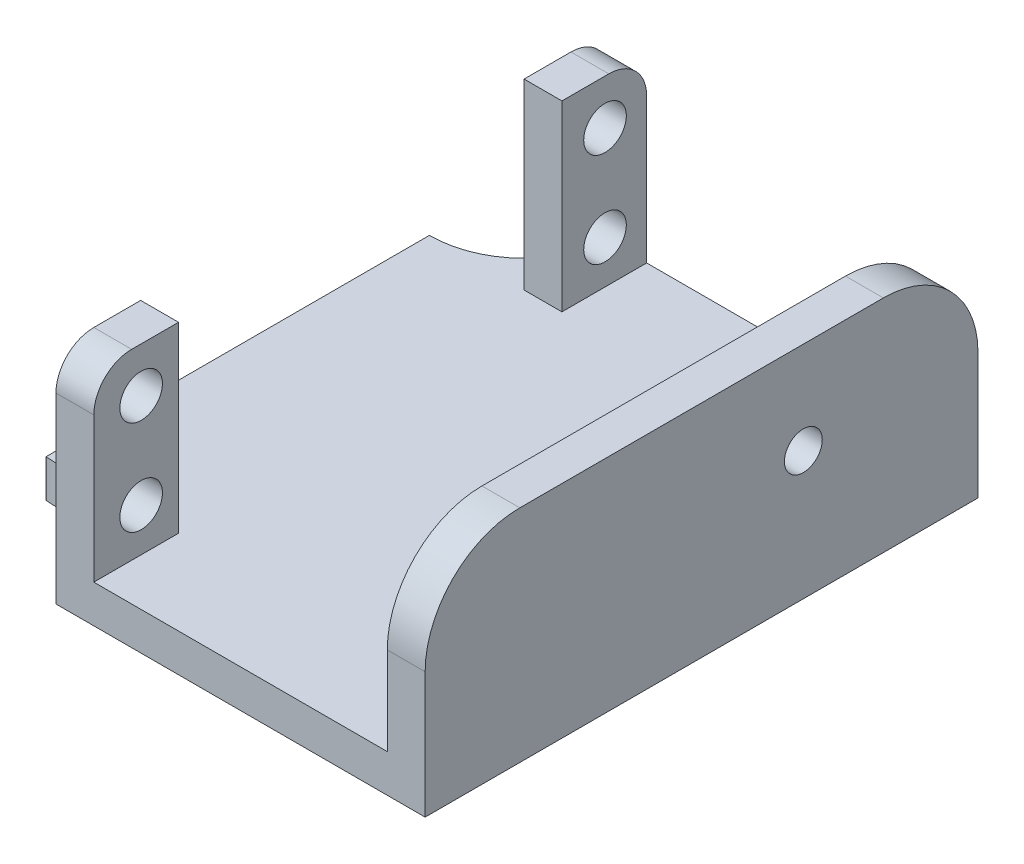
ISO-10303-21;
HEADER;
FILE_DESCRIPTION(('STEP AP214'),'2;1');
FILE_NAME('part.step','',(''),(''),'','','');
FILE_SCHEMA(('AUTOMOTIVE_DESIGN { 1 0 10303 214 1 1 1 1 }'));
ENDSEC;
DATA;
#1=APPLICATION_CONTEXT('core data for automotive mechanical design processes');
#2=APPLICATION_PROTOCOL_DEFINITION('international standard','automotive_design',2000,#1);
#3=PRODUCT_CONTEXT('',#1,'mechanical');
#4=PRODUCT('Part','Part','',(#3));
#5=PRODUCT_RELATED_PRODUCT_CATEGORY('part','',(#4));
#6=PRODUCT_DEFINITION_FORMATION('','',#4);
#7=PRODUCT_DEFINITION_CONTEXT('part definition',#1,'design');
#8=PRODUCT_DEFINITION('design','',#6,#7);
#9=PRODUCT_DEFINITION_SHAPE('','',#8);
#10=(LENGTH_UNIT() NAMED_UNIT(*) SI_UNIT(.MILLI.,.METRE.));
#11=(NAMED_UNIT(*) PLANE_ANGLE_UNIT() SI_UNIT($,.RADIAN.));
#12=(NAMED_UNIT(*) SI_UNIT($,.STERADIAN.) SOLID_ANGLE_UNIT());
#13=UNCERTAINTY_MEASURE_WITH_UNIT(LENGTH_MEASURE(1.E-05),#10,'distance_accuracy_value','');
#14=(GEOMETRIC_REPRESENTATION_CONTEXT(3) GLOBAL_UNCERTAINTY_ASSIGNED_CONTEXT((#13)) GLOBAL_UNIT_ASSIGNED_CONTEXT((#10,
#11,#12)) REPRESENTATION_CONTEXT('',''));
#15=CARTESIAN_POINT('',(0.,0.,0.));
#16=DIRECTION('',(0.,0.,1.));
#17=DIRECTION('',(1.,0.,0.));
#18=AXIS2_PLACEMENT_3D('',#15,#16,#17);
#19=CARTESIAN_POINT('',(0.,4.,0.));
#20=DIRECTION('',(0.,-1.,0.));
#21=DIRECTION('',(0.,0.,-1.));
#22=AXIS2_PLACEMENT_3D('',#19,#20,#21);
#23=PLANE('',#22);
#24=DIRECTION('',(0.,0.,-1.));
#25=VECTOR('',#24,1.);
#26=CARTESIAN_POINT('',(-4.,4.,0.));
#27=LINE('',#26,#25);
#28=CARTESIAN_POINT('',(-4.,4.,0.));
#29=VERTEX_POINT('',#28);
#30=CARTESIAN_POINT('',(-4.,4.,-58.4));
#31=VERTEX_POINT('',#30);
#32=EDGE_CURVE('E193',#29,#31,#27,.T.);
#33=ORIENTED_EDGE('',*,*,#32,.T.);
#34=DIRECTION('',(-1.,0.,0.));
#35=VECTOR('',#34,1.);
#36=CARTESIAN_POINT('',(-39.,4.,-58.4));
#37=LINE('',#36,#35);
#38=CARTESIAN_POINT('',(-35.,4.,-58.4));
#39=VERTEX_POINT('',#38);
#40=EDGE_CURVE('E179',#31,#39,#37,.T.);
#41=ORIENTED_EDGE('',*,*,#40,.T.);
#42=DIRECTION('',(0.,0.,1.));
#43=VECTOR('',#42,1.);
#44=CARTESIAN_POINT('',(-35.,4.,-58.4));
#45=LINE('',#44,#43);
#46=CARTESIAN_POINT('',(-35.,4.,-49.45));
#47=VERTEX_POINT('',#46);
#48=EDGE_CURVE('E223',#39,#47,#45,.T.);
#49=ORIENTED_EDGE('',*,*,#48,.T.);
#50=DIRECTION('',(-1.,0.,0.));
#51=VECTOR('',#50,1.);
#52=CARTESIAN_POINT('',(-35.,4.,-49.45));
#53=LINE('',#52,#51);
#54=CARTESIAN_POINT('',(-39.,4.,-49.45));
#55=VERTEX_POINT('',#54);
#56=EDGE_CURVE('E232',#47,#55,#53,.T.);
#57=ORIENTED_EDGE('',*,*,#56,.T.);
#58=DIRECTION('',(0.,0.,1.));
#59=VECTOR('',#58,1.);
#60=CARTESIAN_POINT('',(-39.,4.,0.));
#61=LINE('',#60,#59);
#62=CARTESIAN_POINT('',(-39.,4.,-58.4));
#63=VERTEX_POINT('',#62);
#64=EDGE_CURVE('E323',#63,#55,#61,.T.);
#65=ORIENTED_EDGE('',*,*,#64,.F.);
#66=CARTESIAN_POINT('',(-48.9447222183428,4.,-59.45));
#67=DIRECTION('',(0.,-1.,0.));
#68=DIRECTION('',(0.,0.,-1.));
#69=AXIS2_PLACEMENT_3D('',#66,#67,#68);
#70=CIRCLE('',#69,10.);
#71=CARTESIAN_POINT('',(-48.9447222183428,4.,-49.45));
#72=VERTEX_POINT('',#71);
#73=EDGE_CURVE('E332',#63,#72,#70,.T.);
#74=ORIENTED_EDGE('',*,*,#73,.T.);
#75=DIRECTION('',(-1.,0.,0.));
#76=VECTOR('',#75,1.);
#77=CARTESIAN_POINT('',(-49.,4.,-49.45));
#78=LINE('',#77,#76);
#79=CARTESIAN_POINT('',(-49.,4.,-49.45));
#80=VERTEX_POINT('',#79);
#81=EDGE_CURVE('E188',#72,#80,#78,.T.);
#82=ORIENTED_EDGE('',*,*,#81,.T.);
#83=DIRECTION('',(0.,0.,1.));
#84=VECTOR('',#83,1.);
#85=CARTESIAN_POINT('',(-49.,4.,-8.94999999999999));
#86=LINE('',#85,#84);
#87=CARTESIAN_POINT('',(-49.,4.,-8.94999999999999));
#88=VERTEX_POINT('',#87);
#89=EDGE_CURVE('E275',#80,#88,#86,.T.);
#90=ORIENTED_EDGE('',*,*,#89,.T.);
#91=DIRECTION('',(1.,0.,0.));
#92=VECTOR('',#91,1.);
#93=CARTESIAN_POINT('',(-39.,4.,-8.95));
#94=LINE('',#93,#92);
#95=CARTESIAN_POINT('',(-48.9447222183428,4.,-8.94999999999999));
#96=VERTEX_POINT('',#95);
#97=EDGE_CURVE('E278',#88,#96,#94,.T.);
#98=ORIENTED_EDGE('',*,*,#97,.T.);
#99=CARTESIAN_POINT('',(-48.9447222183428,4.,1.05000000000001));
#100=DIRECTION('',(0.,-1.,0.));
#101=DIRECTION('',(0.,0.,-1.));
#102=AXIS2_PLACEMENT_3D('',#99,#100,#101);
#103=CIRCLE('',#102,10.);
#104=CARTESIAN_POINT('',(-39.,4.,0.));
#105=VERTEX_POINT('',#104);
#106=EDGE_CURVE('E327',#96,#105,#103,.T.);
#107=ORIENTED_EDGE('',*,*,#106,.T.);
#108=DIRECTION('',(0.,0.,1.));
#109=VECTOR('',#108,1.);
#110=CARTESIAN_POINT('',(-39.,4.,0.));
#111=LINE('',#110,#109);
#112=CARTESIAN_POINT('',(-39.,4.,-8.95));
#113=VERTEX_POINT('',#112);
#114=EDGE_CURVE('E315',#113,#105,#111,.T.);
#115=ORIENTED_EDGE('',*,*,#114,.F.);
#116=DIRECTION('',(-1.,0.,0.));
#117=VECTOR('',#116,1.);
#118=CARTESIAN_POINT('',(-35.,4.,-8.95));
#119=LINE('',#118,#117);
#120=CARTESIAN_POINT('',(-35.,4.,-8.95));
#121=VERTEX_POINT('',#120);
#122=EDGE_CURVE('E265',#121,#113,#119,.T.);
#123=ORIENTED_EDGE('',*,*,#122,.F.);
#124=DIRECTION('',(0.,0.,1.));
#125=VECTOR('',#124,1.);
#126=CARTESIAN_POINT('',(-35.,4.,-8.95));
#127=LINE('',#126,#125);
#128=CARTESIAN_POINT('',(-35.,4.,0.));
#129=VERTEX_POINT('',#128);
#130=EDGE_CURVE('E257',#121,#129,#127,.T.);
#131=ORIENTED_EDGE('',*,*,#130,.T.);
#132=DIRECTION('',(1.,0.,0.));
#133=VECTOR('',#132,1.);
#134=CARTESIAN_POINT('',(0.,4.,0.));
#135=LINE('',#134,#133);
#136=EDGE_CURVE('E189',#129,#29,#135,.T.);
#137=ORIENTED_EDGE('',*,*,#136,.T.);
#138=EDGE_LOOP('',(#33,#41,#49,#57,#65,#74,#82,#90,#98,#107,#115,#123,#131,#137));
#139=FACE_BOUND('',#138,.T.);
#140=ADVANCED_FACE('F34',(#139),#23,.F.);
#141=CARTESIAN_POINT('',(-49.,4.,-8.94999999999999));
#142=DIRECTION('',(1.,0.,0.));
#143=DIRECTION('',(0.,0.,-1.));
#144=AXIS2_PLACEMENT_3D('',#141,#142,#143);
#145=PLANE('',#144);
#146=DIRECTION('',(0.,0.,1.));
#147=VECTOR('',#146,1.);
#148=CARTESIAN_POINT('',(-49.,0.,-8.94999999999999));
#149=LINE('',#148,#147);
#150=CARTESIAN_POINT('',(-49.,0.,-49.45));
#151=VERTEX_POINT('',#150);
#152=CARTESIAN_POINT('',(-49.,0.,-8.94999999999999));
#153=VERTEX_POINT('',#152);
#154=EDGE_CURVE('E272',#151,#153,#149,.T.);
#155=ORIENTED_EDGE('',*,*,#154,.T.);
#156=DIRECTION('',(0.,-1.,0.));
#157=VECTOR('',#156,1.);
#158=CARTESIAN_POINT('',(-49.,4.,-8.94999999999999));
#159=LINE('',#158,#157);
#160=EDGE_CURVE('E312',#88,#153,#159,.T.);
#161=ORIENTED_EDGE('',*,*,#160,.F.);
#162=ORIENTED_EDGE('',*,*,#89,.F.);
#163=DIRECTION('',(0.,-1.,0.));
#164=VECTOR('',#163,1.);
#165=CARTESIAN_POINT('',(-49.,4.,-49.45));
#166=LINE('',#165,#164);
#167=EDGE_CURVE('E284',#80,#151,#166,.T.);
#168=ORIENTED_EDGE('',*,*,#167,.T.);
#169=EDGE_LOOP('',(#155,#161,#162,#168));
#170=FACE_BOUND('',#169,.T.);
#171=ADVANCED_FACE('F392',(#170),#145,.F.);
#172=CARTESIAN_POINT('',(-39.,4.,-8.95));
#173=DIRECTION('',(0.,0.,-1.));
#174=DIRECTION('',(-1.,0.,0.));
#175=AXIS2_PLACEMENT_3D('',#172,#173,#174);
#176=PLANE('',#175);
#177=DIRECTION('',(1.,0.,0.));
#178=VECTOR('',#177,1.);
#179=CARTESIAN_POINT('',(-39.,0.,-8.95));
#180=LINE('',#179,#178);
#181=CARTESIAN_POINT('',(-48.9447222183428,0.,-8.94999999999999));
#182=VERTEX_POINT('',#181);
#183=EDGE_CURVE('E287',#153,#182,#180,.T.);
#184=ORIENTED_EDGE('',*,*,#183,.T.);
#185=DIRECTION('',(0.,1.,0.));
#186=VECTOR('',#185,1.);
#187=CARTESIAN_POINT('',(-48.9447222183428,4.,-8.94999999999999));
#188=LINE('',#187,#186);
#189=EDGE_CURVE('E318',#182,#96,#188,.T.);
#190=ORIENTED_EDGE('',*,*,#189,.T.);
#191=ORIENTED_EDGE('',*,*,#97,.F.);
#192=ORIENTED_EDGE('',*,*,#160,.T.);
#193=EDGE_LOOP('',(#184,#190,#191,#192));
#194=FACE_BOUND('',#193,.T.);
#195=ADVANCED_FACE('F397',(#194),#176,.F.);
#196=CARTESIAN_POINT('',(-39.,4.,0.));
#197=DIRECTION('',(1.,0.,0.));
#198=DIRECTION('',(0.,0.,-1.));
#199=AXIS2_PLACEMENT_3D('',#196,#197,#198);
#200=PLANE('',#199);
#201=DIRECTION('',(0.,-1.,0.));
#202=VECTOR('',#201,1.);
#203=CARTESIAN_POINT('',(-39.,4.,0.));
#204=LINE('',#203,#202);
#205=CARTESIAN_POINT('',(-39.,19.3,0.));
#206=VERTEX_POINT('',#205);
#207=EDGE_CURVE('E310',#206,#105,#204,.T.);
#208=ORIENTED_EDGE('',*,*,#207,.F.);
#209=CARTESIAN_POINT('',(-39.,19.3,-3.99999999999999));
#210=DIRECTION('',(1.,0.,0.));
#211=DIRECTION('',(0.,0.,-1.));
#212=AXIS2_PLACEMENT_3D('',#209,#210,#211);
#213=CIRCLE('',#212,4.);
#214=CARTESIAN_POINT('',(-39.,23.3,-3.99999999999999));
#215=VERTEX_POINT('',#214);
#216=EDGE_CURVE('E346',#206,#215,#213,.F.);
#217=ORIENTED_EDGE('',*,*,#216,.T.);
#218=DIRECTION('',(0.,0.,-1.));
#219=VECTOR('',#218,1.);
#220=CARTESIAN_POINT('',(-39.,23.3,-8.95));
#221=LINE('',#220,#219);
#222=CARTESIAN_POINT('',(-39.,23.3,-8.95));
#223=VERTEX_POINT('',#222);
#224=EDGE_CURVE('E258',#215,#223,#221,.T.);
#225=ORIENTED_EDGE('',*,*,#224,.T.);
#226=DIRECTION('',(0.,-1.,0.));
#227=VECTOR('',#226,1.);
#228=CARTESIAN_POINT('',(-39.,23.3,-8.95));
#229=LINE('',#228,#227);
#230=EDGE_CURVE('E251',#223,#113,#229,.T.);
#231=ORIENTED_EDGE('',*,*,#230,.T.);
#232=ORIENTED_EDGE('',*,*,#114,.T.);
#233=EDGE_LOOP('',(#208,#217,#225,#231,#232));
#234=FACE_BOUND('',#233,.T.);
#235=CARTESIAN_POINT('',(-39.,8.55,-4.99999999999999));
#236=DIRECTION('',(-1.,0.,0.));
#237=DIRECTION('',(0.,0.,1.));
#238=AXIS2_PLACEMENT_3D('',#235,#236,#237);
#239=CIRCLE('',#238,2.25);
#240=CARTESIAN_POINT('',(-39.,8.55,-2.74999999999999));
#241=VERTEX_POINT('',#240);
#242=EDGE_CURVE('E239',#241,#241,#239,.T.);
#243=ORIENTED_EDGE('',*,*,#242,.F.);
#244=EDGE_LOOP('',(#243));
#245=FACE_BOUND('',#244,.T.);
#246=CARTESIAN_POINT('',(-39.,18.55,-4.99999999999999));
#247=DIRECTION('',(-1.,0.,0.));
#248=DIRECTION('',(0.,0.,1.));
#249=AXIS2_PLACEMENT_3D('',#246,#247,#248);
#250=CIRCLE('',#249,2.25);
#251=CARTESIAN_POINT('',(-39.,18.55,-2.74999999999999));
#252=VERTEX_POINT('',#251);
#253=EDGE_CURVE('E245',#252,#252,#250,.T.);
#254=ORIENTED_EDGE('',*,*,#253,.F.);
#255=EDGE_LOOP('',(#254));
#256=FACE_BOUND('',#255,.T.);
#257=ADVANCED_FACE('F420',(#234,#245,#256),#200,.F.);
#258=CARTESIAN_POINT('',(0.,4.,0.));
#259=DIRECTION('',(0.,0.,-1.));
#260=DIRECTION('',(-1.,0.,0.));
#261=AXIS2_PLACEMENT_3D('',#258,#259,#260);
#262=PLANE('',#261);
#263=DIRECTION('',(0.,-1.,0.));
#264=VECTOR('',#263,1.);
#265=CARTESIAN_POINT('',(0.,4.,0.));
#266=LINE('',#265,#264);
#267=CARTESIAN_POINT('',(0.,13.3,0.));
#268=VERTEX_POINT('',#267);
#269=CARTESIAN_POINT('',(0.,0.,0.));
#270=VERTEX_POINT('',#269);
#271=EDGE_CURVE('E307',#268,#270,#266,.T.);
#272=ORIENTED_EDGE('',*,*,#271,.F.);
#273=DIRECTION('',(1.,0.,0.));
#274=VECTOR('',#273,1.);
#275=CARTESIAN_POINT('',(-4.,13.3,0.));
#276=LINE('',#275,#274);
#277=CARTESIAN_POINT('',(-4.,13.3,0.));
#278=VERTEX_POINT('',#277);
#279=EDGE_CURVE('E57',#268,#278,#276,.F.);
#280=ORIENTED_EDGE('',*,*,#279,.T.);
#281=DIRECTION('',(0.,-1.,0.));
#282=VECTOR('',#281,1.);
#283=CARTESIAN_POINT('',(-4.,23.3,0.));
#284=LINE('',#283,#282);
#285=EDGE_CURVE('E196',#278,#29,#284,.T.);
#286=ORIENTED_EDGE('',*,*,#285,.T.);
#287=ORIENTED_EDGE('',*,*,#136,.F.);
#288=DIRECTION('',(0.,1.,0.));
#289=VECTOR('',#288,1.);
#290=CARTESIAN_POINT('',(-35.,23.3,0.));
#291=LINE('',#290,#289);
#292=CARTESIAN_POINT('',(-35.,19.3,0.));
#293=VERTEX_POINT('',#292);
#294=EDGE_CURVE('E260',#129,#293,#291,.T.);
#295=ORIENTED_EDGE('',*,*,#294,.T.);
#296=DIRECTION('',(-1.,0.,0.));
#297=VECTOR('',#296,1.);
#298=CARTESIAN_POINT('',(-39.,19.3,0.));
#299=LINE('',#298,#297);
#300=EDGE_CURVE('E343',#293,#206,#299,.T.);
#301=ORIENTED_EDGE('',*,*,#300,.T.);
#302=ORIENTED_EDGE('',*,*,#207,.T.);
#303=CARTESIAN_POINT('',(-39.,0.,0.));
#304=VERTEX_POINT('',#303);
#305=EDGE_CURVE('E309',#105,#304,#204,.T.);
#306=ORIENTED_EDGE('',*,*,#305,.T.);
#307=DIRECTION('',(1.,0.,0.));
#308=VECTOR('',#307,1.);
#309=CARTESIAN_POINT('',(0.,0.,0.));
#310=LINE('',#309,#308);
#311=EDGE_CURVE('E290',#304,#270,#310,.T.);
#312=ORIENTED_EDGE('',*,*,#311,.T.);
#313=EDGE_LOOP('',(#272,#280,#286,#287,#295,#301,#302,#306,#312));
#314=FACE_BOUND('',#313,.T.);
#315=ADVANCED_FACE('F373',(#314),#262,.F.);
#316=CARTESIAN_POINT('',(0.,4.,-58.4));
#317=DIRECTION('',(-1.,0.,0.));
#318=DIRECTION('',(0.,0.,1.));
#319=AXIS2_PLACEMENT_3D('',#316,#317,#318);
#320=PLANE('',#319);
#321=DIRECTION('',(0.,0.,1.));
#322=VECTOR('',#321,1.);
#323=CARTESIAN_POINT('',(0.,23.3,0.));
#324=LINE('',#323,#322);
#325=CARTESIAN_POINT('',(0.,23.3,-48.4));
#326=VERTEX_POINT('',#325);
#327=CARTESIAN_POINT('',(0.,23.3,-10.));
#328=VERTEX_POINT('',#327);
#329=EDGE_CURVE('E206',#326,#328,#324,.T.);
#330=ORIENTED_EDGE('',*,*,#329,.T.);
#331=CARTESIAN_POINT('',(0.,13.3,-10.));
#332=DIRECTION('',(-1.,0.,0.));
#333=DIRECTION('',(0.,0.,1.));
#334=AXIS2_PLACEMENT_3D('',#331,#332,#333);
#335=CIRCLE('',#334,10.);
#336=EDGE_CURVE('E359',#328,#268,#335,.F.);
#337=ORIENTED_EDGE('',*,*,#336,.T.);
#338=ORIENTED_EDGE('',*,*,#271,.T.);
#339=DIRECTION('',(0.,0.,-1.));
#340=VECTOR('',#339,1.);
#341=CARTESIAN_POINT('',(0.,0.,-58.4));
#342=LINE('',#341,#340);
#343=CARTESIAN_POINT('',(0.,0.,-58.4));
#344=VERTEX_POINT('',#343);
#345=EDGE_CURVE('E293',#270,#344,#342,.T.);
#346=ORIENTED_EDGE('',*,*,#345,.T.);
#347=DIRECTION('',(0.,-1.,0.));
#348=VECTOR('',#347,1.);
#349=CARTESIAN_POINT('',(0.,4.,-58.4));
#350=LINE('',#349,#348);
#351=CARTESIAN_POINT('',(0.,13.3,-58.4));
#352=VERTEX_POINT('',#351);
#353=EDGE_CURVE('E305',#352,#344,#350,.T.);
#354=ORIENTED_EDGE('',*,*,#353,.F.);
#355=CARTESIAN_POINT('',(0.,13.3,-48.4));
#356=DIRECTION('',(-1.,0.,0.));
#357=DIRECTION('',(0.,0.,1.));
#358=AXIS2_PLACEMENT_3D('',#355,#356,#357);
#359=CIRCLE('',#358,10.);
#360=EDGE_CURVE('E357',#352,#326,#359,.F.);
#361=ORIENTED_EDGE('',*,*,#360,.T.);
#362=EDGE_LOOP('',(#330,#337,#338,#346,#354,#361));
#363=FACE_BOUND('',#362,.T.);
#364=CARTESIAN_POINT('',(0.,13.55,-39.95));
#365=DIRECTION('',(1.,0.,0.));
#366=DIRECTION('',(0.,0.,-1.));
#367=AXIS2_PLACEMENT_3D('',#364,#365,#366);
#368=CIRCLE('',#367,2.);
#369=CARTESIAN_POINT('',(0.,13.55,-41.95));
#370=VERTEX_POINT('',#369);
#371=EDGE_CURVE('E456',#370,#370,#368,.T.);
#372=ORIENTED_EDGE('',*,*,#371,.F.);
#373=EDGE_LOOP('',(#372));
#374=FACE_BOUND('',#373,.T.);
#375=ADVANCED_FACE('F371',(#363,#374),#320,.F.);
#376=CARTESIAN_POINT('',(-39.,4.,-58.4));
#377=DIRECTION('',(0.,0.,1.));
#378=DIRECTION('',(1.,0.,0.));
#379=AXIS2_PLACEMENT_3D('',#376,#377,#378);
#380=PLANE('',#379);
#381=DIRECTION('',(0.,1.,0.));
#382=VECTOR('',#381,1.);
#383=CARTESIAN_POINT('',(-4.,23.3,-58.4));
#384=LINE('',#383,#382);
#385=CARTESIAN_POINT('',(-4.,13.3,-58.4));
#386=VERTEX_POINT('',#385);
#387=EDGE_CURVE('E182',#31,#386,#384,.T.);
#388=ORIENTED_EDGE('',*,*,#387,.T.);
#389=DIRECTION('',(1.,0.,0.));
#390=VECTOR('',#389,1.);
#391=CARTESIAN_POINT('',(0.,13.3,-58.4));
#392=LINE('',#391,#390);
#393=EDGE_CURVE('E11',#386,#352,#392,.T.);
#394=ORIENTED_EDGE('',*,*,#393,.T.);
#395=ORIENTED_EDGE('',*,*,#353,.T.);
#396=DIRECTION('',(-1.,0.,0.));
#397=VECTOR('',#396,1.);
#398=CARTESIAN_POINT('',(-39.,0.,-58.4));
#399=LINE('',#398,#397);
#400=CARTESIAN_POINT('',(-39.,0.,-58.4));
#401=VERTEX_POINT('',#400);
#402=EDGE_CURVE('E296',#344,#401,#399,.T.);
#403=ORIENTED_EDGE('',*,*,#402,.T.);
#404=DIRECTION('',(0.,-1.,0.));
#405=VECTOR('',#404,1.);
#406=CARTESIAN_POINT('',(-39.,4.,-58.4));
#407=LINE('',#406,#405);
#408=EDGE_CURVE('E302',#63,#401,#407,.T.);
#409=ORIENTED_EDGE('',*,*,#408,.F.);
#410=CARTESIAN_POINT('',(-39.,19.3,-58.4));
#411=VERTEX_POINT('',#410);
#412=EDGE_CURVE('E303',#411,#63,#407,.T.);
#413=ORIENTED_EDGE('',*,*,#412,.F.);
#414=DIRECTION('',(-1.,0.,0.));
#415=VECTOR('',#414,1.);
#416=CARTESIAN_POINT('',(-35.,19.3,-58.4));
#417=LINE('',#416,#415);
#418=CARTESIAN_POINT('',(-35.,19.3,-58.4));
#419=VERTEX_POINT('',#418);
#420=EDGE_CURVE('E339',#411,#419,#417,.F.);
#421=ORIENTED_EDGE('',*,*,#420,.T.);
#422=DIRECTION('',(0.,-1.,0.));
#423=VECTOR('',#422,1.);
#424=CARTESIAN_POINT('',(-35.,23.3,-58.4));
#425=LINE('',#424,#423);
#426=EDGE_CURVE('E185',#419,#39,#425,.T.);
#427=ORIENTED_EDGE('',*,*,#426,.T.);
#428=ORIENTED_EDGE('',*,*,#40,.F.);
#429=EDGE_LOOP('',(#388,#394,#395,#403,#409,#413,#421,#427,#428));
#430=FACE_BOUND('',#429,.T.);
#431=ADVANCED_FACE('F181',(#430),#380,.F.);
#432=CARTESIAN_POINT('',(-39.,4.,-49.45));
#433=DIRECTION('',(1.,0.,0.));
#434=DIRECTION('',(0.,0.,-1.));
#435=AXIS2_PLACEMENT_3D('',#432,#433,#434);
#436=PLANE('',#435);
#437=DIRECTION('',(0.,0.,-1.));
#438=VECTOR('',#437,1.);
#439=CARTESIAN_POINT('',(-39.,23.3,-58.4));
#440=LINE('',#439,#438);
#441=CARTESIAN_POINT('',(-39.,23.3,-49.45));
#442=VERTEX_POINT('',#441);
#443=CARTESIAN_POINT('',(-39.,23.3,-54.4));
#444=VERTEX_POINT('',#443);
#445=EDGE_CURVE('E224',#442,#444,#440,.T.);
#446=ORIENTED_EDGE('',*,*,#445,.T.);
#447=CARTESIAN_POINT('',(-39.,19.3,-54.4));
#448=DIRECTION('',(1.,0.,0.));
#449=DIRECTION('',(0.,0.,-1.));
#450=AXIS2_PLACEMENT_3D('',#447,#448,#449);
#451=CIRCLE('',#450,4.);
#452=EDGE_CURVE('E337',#444,#411,#451,.F.);
#453=ORIENTED_EDGE('',*,*,#452,.T.);
#454=ORIENTED_EDGE('',*,*,#412,.T.);
#455=ORIENTED_EDGE('',*,*,#64,.T.);
#456=DIRECTION('',(0.,1.,0.));
#457=VECTOR('',#456,1.);
#458=CARTESIAN_POINT('',(-39.,23.3,-49.45));
#459=LINE('',#458,#457);
#460=EDGE_CURVE('E219',#55,#442,#459,.T.);
#461=ORIENTED_EDGE('',*,*,#460,.T.);
#462=EDGE_LOOP('',(#446,#453,#454,#455,#461));
#463=FACE_BOUND('',#462,.T.);
#464=CARTESIAN_POINT('',(-39.,8.55,-54.));
#465=DIRECTION('',(-1.,0.,0.));
#466=DIRECTION('',(0.,0.,1.));
#467=AXIS2_PLACEMENT_3D('',#464,#465,#466);
#468=CIRCLE('',#467,2.25);
#469=CARTESIAN_POINT('',(-39.,8.55,-51.75));
#470=VERTEX_POINT('',#469);
#471=EDGE_CURVE('E202',#470,#470,#468,.T.);
#472=ORIENTED_EDGE('',*,*,#471,.F.);
#473=EDGE_LOOP('',(#472));
#474=FACE_BOUND('',#473,.T.);
#475=CARTESIAN_POINT('',(-39.,18.55,-54.));
#476=DIRECTION('',(-1.,0.,0.));
#477=DIRECTION('',(0.,0.,1.));
#478=AXIS2_PLACEMENT_3D('',#475,#476,#477);
#479=CIRCLE('',#478,2.25);
#480=CARTESIAN_POINT('',(-39.,18.55,-51.75));
#481=VERTEX_POINT('',#480);
#482=EDGE_CURVE('E213',#481,#481,#479,.T.);
#483=ORIENTED_EDGE('',*,*,#482,.F.);
#484=EDGE_LOOP('',(#483));
#485=FACE_BOUND('',#484,.T.);
#486=ADVANCED_FACE('F409',(#463,#474,#485),#436,.F.);
#487=CARTESIAN_POINT('',(-49.,4.,-49.45));
#488=DIRECTION('',(0.,0.,1.));
#489=DIRECTION('',(1.,0.,0.));
#490=AXIS2_PLACEMENT_3D('',#487,#488,#489);
#491=PLANE('',#490);
#492=ORIENTED_EDGE('',*,*,#81,.F.);
#493=DIRECTION('',(0.,-1.,0.));
#494=VECTOR('',#493,1.);
#495=CARTESIAN_POINT('',(-48.9447222183428,4.,-49.45));
#496=LINE('',#495,#494);
#497=CARTESIAN_POINT('',(-48.9447222183428,0.,-49.45));
#498=VERTEX_POINT('',#497);
#499=EDGE_CURVE('E320',#72,#498,#496,.T.);
#500=ORIENTED_EDGE('',*,*,#499,.T.);
#501=DIRECTION('',(-1.,0.,0.));
#502=VECTOR('',#501,1.);
#503=CARTESIAN_POINT('',(-49.,0.,-49.45));
#504=LINE('',#503,#502);
#505=EDGE_CURVE('E279',#498,#151,#504,.T.);
#506=ORIENTED_EDGE('',*,*,#505,.T.);
#507=ORIENTED_EDGE('',*,*,#167,.F.);
#508=EDGE_LOOP('',(#492,#500,#506,#507));
#509=FACE_BOUND('',#508,.T.);
#510=ADVANCED_FACE('F406',(#509),#491,.F.);
#511=CARTESIAN_POINT('',(0.,0.,0.));
#512=DIRECTION('',(0.,-1.,0.));
#513=DIRECTION('',(0.,0.,-1.));
#514=AXIS2_PLACEMENT_3D('',#511,#512,#513);
#515=PLANE('',#514);
#516=ORIENTED_EDGE('',*,*,#154,.F.);
#517=ORIENTED_EDGE('',*,*,#505,.F.);
#518=CARTESIAN_POINT('',(-48.9447222183428,0.,-59.45));
#519=DIRECTION('',(0.,-1.,0.));
#520=DIRECTION('',(0.,0.,-1.));
#521=AXIS2_PLACEMENT_3D('',#518,#519,#520);
#522=CIRCLE('',#521,10.);
#523=EDGE_CURVE('E330',#498,#401,#522,.F.);
#524=ORIENTED_EDGE('',*,*,#523,.T.);
#525=ORIENTED_EDGE('',*,*,#402,.F.);
#526=ORIENTED_EDGE('',*,*,#345,.F.);
#527=ORIENTED_EDGE('',*,*,#311,.F.);
#528=CARTESIAN_POINT('',(-48.9447222183428,0.,1.05000000000001));
#529=DIRECTION('',(0.,-1.,0.));
#530=DIRECTION('',(0.,0.,-1.));
#531=AXIS2_PLACEMENT_3D('',#528,#529,#530);
#532=CIRCLE('',#531,10.);
#533=EDGE_CURVE('E325',#304,#182,#532,.F.);
#534=ORIENTED_EDGE('',*,*,#533,.T.);
#535=ORIENTED_EDGE('',*,*,#183,.F.);
#536=EDGE_LOOP('',(#516,#517,#524,#525,#526,#527,#534,#535));
#537=FACE_BOUND('',#536,.T.);
#538=ADVANCED_FACE('F381',(#537),#515,.T.);
#539=CARTESIAN_POINT('',(-35.,23.3,-8.95));
#540=DIRECTION('',(0.,0.,-1.));
#541=DIRECTION('',(0.,1.,0.));
#542=AXIS2_PLACEMENT_3D('',#539,#540,#541);
#543=PLANE('',#542);
#544=ORIENTED_EDGE('',*,*,#230,.F.);
#545=DIRECTION('',(-1.,0.,0.));
#546=VECTOR('',#545,1.);
#547=CARTESIAN_POINT('',(-35.,23.3,-8.95));
#548=LINE('',#547,#546);
#549=CARTESIAN_POINT('',(-35.,23.3,-8.95));
#550=VERTEX_POINT('',#549);
#551=EDGE_CURVE('E269',#550,#223,#548,.T.);
#552=ORIENTED_EDGE('',*,*,#551,.F.);
#553=DIRECTION('',(0.,-1.,0.));
#554=VECTOR('',#553,1.);
#555=CARTESIAN_POINT('',(-35.,23.3,-8.95));
#556=LINE('',#555,#554);
#557=EDGE_CURVE('E254',#550,#121,#556,.T.);
#558=ORIENTED_EDGE('',*,*,#557,.T.);
#559=ORIENTED_EDGE('',*,*,#122,.T.);
#560=EDGE_LOOP('',(#544,#552,#558,#559));
#561=FACE_BOUND('',#560,.T.);
#562=ADVANCED_FACE('F402',(#561),#543,.T.);
#563=CARTESIAN_POINT('',(-35.,23.3,-8.95));
#564=DIRECTION('',(0.,1.,0.));
#565=DIRECTION('',(0.,0.,1.));
#566=AXIS2_PLACEMENT_3D('',#563,#564,#565);
#567=PLANE('',#566);
#568=ORIENTED_EDGE('',*,*,#224,.F.);
#569=DIRECTION('',(-1.,0.,0.));
#570=VECTOR('',#569,1.);
#571=CARTESIAN_POINT('',(-35.,23.3,-4.));
#572=LINE('',#571,#570);
#573=CARTESIAN_POINT('',(-35.,23.3,-4.));
#574=VERTEX_POINT('',#573);
#575=EDGE_CURVE('E348',#215,#574,#572,.F.);
#576=ORIENTED_EDGE('',*,*,#575,.T.);
#577=DIRECTION('',(0.,0.,-1.));
#578=VECTOR('',#577,1.);
#579=CARTESIAN_POINT('',(-35.,23.3,-8.95));
#580=LINE('',#579,#578);
#581=EDGE_CURVE('E263',#574,#550,#580,.T.);
#582=ORIENTED_EDGE('',*,*,#581,.T.);
#583=ORIENTED_EDGE('',*,*,#551,.T.);
#584=EDGE_LOOP('',(#568,#576,#582,#583));
#585=FACE_BOUND('',#584,.T.);
#586=ADVANCED_FACE('F500',(#585),#567,.T.);
#587=CARTESIAN_POINT('',(-35.,0.,0.));
#588=DIRECTION('',(-1.,0.,0.));
#589=DIRECTION('',(0.,0.,1.));
#590=AXIS2_PLACEMENT_3D('',#587,#588,#589);
#591=PLANE('',#590);
#592=CARTESIAN_POINT('',(-35.,8.55,-4.99999999999999));
#593=DIRECTION('',(-1.,0.,0.));
#594=DIRECTION('',(0.,0.,1.));
#595=AXIS2_PLACEMENT_3D('',#592,#593,#594);
#596=CIRCLE('',#595,2.25);
#597=CARTESIAN_POINT('',(-35.,8.55,-2.74999999999999));
#598=VERTEX_POINT('',#597);
#599=EDGE_CURVE('E242',#598,#598,#596,.T.);
#600=ORIENTED_EDGE('',*,*,#599,.T.);
#601=EDGE_LOOP('',(#600));
#602=FACE_BOUND('',#601,.T.);
#603=CARTESIAN_POINT('',(-35.,18.55,-4.99999999999999));
#604=DIRECTION('',(-1.,0.,0.));
#605=DIRECTION('',(0.,0.,1.));
#606=AXIS2_PLACEMENT_3D('',#603,#604,#605);
#607=CIRCLE('',#606,2.25);
#608=CARTESIAN_POINT('',(-35.,18.55,-2.74999999999999));
#609=VERTEX_POINT('',#608);
#610=EDGE_CURVE('E248',#609,#609,#607,.T.);
#611=ORIENTED_EDGE('',*,*,#610,.T.);
#612=EDGE_LOOP('',(#611));
#613=FACE_BOUND('',#612,.T.);
#614=ORIENTED_EDGE('',*,*,#581,.F.);
#615=CARTESIAN_POINT('',(-35.,19.3,-4.));
#616=DIRECTION('',(-1.,0.,0.));
#617=DIRECTION('',(0.,0.,1.));
#618=AXIS2_PLACEMENT_3D('',#615,#616,#617);
#619=CIRCLE('',#618,4.);
#620=EDGE_CURVE('E350',#574,#293,#619,.F.);
#621=ORIENTED_EDGE('',*,*,#620,.T.);
#622=ORIENTED_EDGE('',*,*,#294,.F.);
#623=ORIENTED_EDGE('',*,*,#130,.F.);
#624=ORIENTED_EDGE('',*,*,#557,.F.);
#625=EDGE_LOOP('',(#614,#621,#622,#623,#624));
#626=FACE_BOUND('',#625,.T.);
#627=ADVANCED_FACE('F452',(#602,#613,#626),#591,.F.);
#628=CARTESIAN_POINT('',(-35.,18.55,-4.99999999999999));
#629=DIRECTION('',(-1.,0.,0.));
#630=DIRECTION('',(0.,0.,1.));
#631=AXIS2_PLACEMENT_3D('',#628,#629,#630);
#632=CYLINDRICAL_SURFACE('',#631,2.25);
#633=ORIENTED_EDGE('',*,*,#610,.F.);
#634=EDGE_LOOP('',(#633));
#635=FACE_BOUND('',#634,.T.);
#636=ORIENTED_EDGE('',*,*,#253,.T.);
#637=EDGE_LOOP('',(#636));
#638=FACE_BOUND('',#637,.T.);
#639=ADVANCED_FACE('F494',(#635,#638),#632,.F.);
#640=CARTESIAN_POINT('',(-35.,8.55,-4.99999999999999));
#641=DIRECTION('',(-1.,0.,0.));
#642=DIRECTION('',(0.,0.,1.));
#643=AXIS2_PLACEMENT_3D('',#640,#641,#642);
#644=CYLINDRICAL_SURFACE('',#643,2.25);
#645=ORIENTED_EDGE('',*,*,#599,.F.);
#646=EDGE_LOOP('',(#645));
#647=FACE_BOUND('',#646,.T.);
#648=ORIENTED_EDGE('',*,*,#242,.T.);
#649=EDGE_LOOP('',(#648));
#650=FACE_BOUND('',#649,.T.);
#651=ADVANCED_FACE('F487',(#647,#650),#644,.F.);
#652=CARTESIAN_POINT('',(-35.,23.3,-58.4));
#653=DIRECTION('',(0.,1.,0.));
#654=DIRECTION('',(0.,0.,1.));
#655=AXIS2_PLACEMENT_3D('',#652,#653,#654);
#656=PLANE('',#655);
#657=DIRECTION('',(0.,0.,-1.));
#658=VECTOR('',#657,1.);
#659=CARTESIAN_POINT('',(-35.,23.3,-58.4));
#660=LINE('',#659,#658);
#661=CARTESIAN_POINT('',(-35.,23.3,-49.45));
#662=VERTEX_POINT('',#661);
#663=CARTESIAN_POINT('',(-35.,23.3,-54.4));
#664=VERTEX_POINT('',#663);
#665=EDGE_CURVE('E229',#662,#664,#660,.T.);
#666=ORIENTED_EDGE('',*,*,#665,.T.);
#667=DIRECTION('',(-1.,0.,0.));
#668=VECTOR('',#667,1.);
#669=CARTESIAN_POINT('',(-39.,23.3,-54.4));
#670=LINE('',#669,#668);
#671=EDGE_CURVE('E334',#664,#444,#670,.T.);
#672=ORIENTED_EDGE('',*,*,#671,.T.);
#673=ORIENTED_EDGE('',*,*,#445,.F.);
#674=DIRECTION('',(-1.,0.,0.));
#675=VECTOR('',#674,1.);
#676=CARTESIAN_POINT('',(-35.,23.3,-49.45));
#677=LINE('',#676,#675);
#678=EDGE_CURVE('E237',#662,#442,#677,.T.);
#679=ORIENTED_EDGE('',*,*,#678,.F.);
#680=EDGE_LOOP('',(#666,#672,#673,#679));
#681=FACE_BOUND('',#680,.T.);
#682=ADVANCED_FACE('F484',(#681),#656,.T.);
#683=CARTESIAN_POINT('',(-35.,23.3,-49.45));
#684=DIRECTION('',(0.,0.,1.));
#685=DIRECTION('',(1.,0.,0.));
#686=AXIS2_PLACEMENT_3D('',#683,#684,#685);
#687=PLANE('',#686);
#688=ORIENTED_EDGE('',*,*,#460,.F.);
#689=ORIENTED_EDGE('',*,*,#56,.F.);
#690=DIRECTION('',(0.,1.,0.));
#691=VECTOR('',#690,1.);
#692=CARTESIAN_POINT('',(-35.,23.3,-49.45));
#693=LINE('',#692,#691);
#694=EDGE_CURVE('E226',#47,#662,#693,.T.);
#695=ORIENTED_EDGE('',*,*,#694,.T.);
#696=ORIENTED_EDGE('',*,*,#678,.T.);
#697=EDGE_LOOP('',(#688,#689,#695,#696));
#698=FACE_BOUND('',#697,.T.);
#699=ADVANCED_FACE('F482',(#698),#687,.T.);
#700=CARTESIAN_POINT('',(-35.,0.,0.));
#701=DIRECTION('',(-1.,0.,0.));
#702=DIRECTION('',(0.,0.,1.));
#703=AXIS2_PLACEMENT_3D('',#700,#701,#702);
#704=PLANE('',#703);
#705=CARTESIAN_POINT('',(-35.,8.55,-54.));
#706=DIRECTION('',(-1.,0.,0.));
#707=DIRECTION('',(0.,0.,1.));
#708=AXIS2_PLACEMENT_3D('',#705,#706,#707);
#709=CIRCLE('',#708,2.25);
#710=CARTESIAN_POINT('',(-35.,8.55,-51.75));
#711=VERTEX_POINT('',#710);
#712=EDGE_CURVE('E210',#711,#711,#709,.T.);
#713=ORIENTED_EDGE('',*,*,#712,.T.);
#714=EDGE_LOOP('',(#713));
#715=FACE_BOUND('',#714,.T.);
#716=CARTESIAN_POINT('',(-35.,18.55,-54.));
#717=DIRECTION('',(-1.,0.,0.));
#718=DIRECTION('',(0.,0.,1.));
#719=AXIS2_PLACEMENT_3D('',#716,#717,#718);
#720=CIRCLE('',#719,2.25);
#721=CARTESIAN_POINT('',(-35.,18.55,-51.75));
#722=VERTEX_POINT('',#721);
#723=EDGE_CURVE('E216',#722,#722,#720,.T.);
#724=ORIENTED_EDGE('',*,*,#723,.T.);
#725=EDGE_LOOP('',(#724));
#726=FACE_BOUND('',#725,.T.);
#727=ORIENTED_EDGE('',*,*,#426,.F.);
#728=CARTESIAN_POINT('',(-35.,19.3,-54.4));
#729=DIRECTION('',(-1.,0.,0.));
#730=DIRECTION('',(0.,0.,1.));
#731=AXIS2_PLACEMENT_3D('',#728,#729,#730);
#732=CIRCLE('',#731,4.);
#733=EDGE_CURVE('E341',#419,#664,#732,.F.);
#734=ORIENTED_EDGE('',*,*,#733,.T.);
#735=ORIENTED_EDGE('',*,*,#665,.F.);
#736=ORIENTED_EDGE('',*,*,#694,.F.);
#737=ORIENTED_EDGE('',*,*,#48,.F.);
#738=EDGE_LOOP('',(#727,#734,#735,#736,#737));
#739=FACE_BOUND('',#738,.T.);
#740=ADVANCED_FACE('F478',(#715,#726,#739),#704,.F.);
#741=CARTESIAN_POINT('',(-35.,18.55,-54.));
#742=DIRECTION('',(-1.,0.,0.));
#743=DIRECTION('',(0.,0.,1.));
#744=AXIS2_PLACEMENT_3D('',#741,#742,#743);
#745=CYLINDRICAL_SURFACE('',#744,2.25);
#746=ORIENTED_EDGE('',*,*,#723,.F.);
#747=EDGE_LOOP('',(#746));
#748=FACE_BOUND('',#747,.T.);
#749=ORIENTED_EDGE('',*,*,#482,.T.);
#750=EDGE_LOOP('',(#749));
#751=FACE_BOUND('',#750,.T.);
#752=ADVANCED_FACE('F474',(#748,#751),#745,.F.);
#753=CARTESIAN_POINT('',(-35.,8.55,-54.));
#754=DIRECTION('',(-1.,0.,0.));
#755=DIRECTION('',(0.,0.,1.));
#756=AXIS2_PLACEMENT_3D('',#753,#754,#755);
#757=CYLINDRICAL_SURFACE('',#756,2.25);
#758=ORIENTED_EDGE('',*,*,#712,.F.);
#759=EDGE_LOOP('',(#758));
#760=FACE_BOUND('',#759,.T.);
#761=ORIENTED_EDGE('',*,*,#471,.T.);
#762=EDGE_LOOP('',(#761));
#763=FACE_BOUND('',#762,.T.);
#764=ADVANCED_FACE('F431',(#760,#763),#757,.F.);
#765=CARTESIAN_POINT('',(-48.9447222183428,4.,1.05000000000001));
#766=DIRECTION('',(0.,1.,0.));
#767=DIRECTION('',(0.,0.,1.));
#768=AXIS2_PLACEMENT_3D('',#765,#766,#767);
#769=CYLINDRICAL_SURFACE('',#768,10.);
#770=ORIENTED_EDGE('',*,*,#106,.F.);
#771=ORIENTED_EDGE('',*,*,#189,.F.);
#772=ORIENTED_EDGE('',*,*,#533,.F.);
#773=ORIENTED_EDGE('',*,*,#305,.F.);
#774=EDGE_LOOP('',(#770,#771,#772,#773));
#775=FACE_BOUND('',#774,.T.);
#776=ADVANCED_FACE('F427',(#775),#769,.F.);
#777=CARTESIAN_POINT('',(-48.9447222183428,4.,-59.45));
#778=DIRECTION('',(0.,-1.,0.));
#779=DIRECTION('',(0.,0.,-1.));
#780=AXIS2_PLACEMENT_3D('',#777,#778,#779);
#781=CYLINDRICAL_SURFACE('',#780,10.);
#782=ORIENTED_EDGE('',*,*,#73,.F.);
#783=ORIENTED_EDGE('',*,*,#408,.T.);
#784=ORIENTED_EDGE('',*,*,#523,.F.);
#785=ORIENTED_EDGE('',*,*,#499,.F.);
#786=EDGE_LOOP('',(#782,#783,#784,#785));
#787=FACE_BOUND('',#786,.T.);
#788=ADVANCED_FACE('F430',(#787),#781,.F.);
#789=CARTESIAN_POINT('',(-35.,19.3,-54.4));
#790=DIRECTION('',(1.,0.,0.));
#791=DIRECTION('',(0.,0.,-1.));
#792=AXIS2_PLACEMENT_3D('',#789,#790,#791);
#793=CYLINDRICAL_SURFACE('',#792,4.);
#794=ORIENTED_EDGE('',*,*,#733,.F.);
#795=ORIENTED_EDGE('',*,*,#420,.F.);
#796=ORIENTED_EDGE('',*,*,#452,.F.);
#797=ORIENTED_EDGE('',*,*,#671,.F.);
#798=EDGE_LOOP('',(#794,#795,#796,#797));
#799=FACE_BOUND('',#798,.T.);
#800=ADVANCED_FACE('F435',(#799),#793,.T.);
#801=CARTESIAN_POINT('',(0.,19.3,-4.));
#802=DIRECTION('',(1.,0.,0.));
#803=DIRECTION('',(0.,0.,-1.));
#804=AXIS2_PLACEMENT_3D('',#801,#802,#803);
#805=CYLINDRICAL_SURFACE('',#804,4.);
#806=ORIENTED_EDGE('',*,*,#620,.F.);
#807=ORIENTED_EDGE('',*,*,#575,.F.);
#808=ORIENTED_EDGE('',*,*,#216,.F.);
#809=ORIENTED_EDGE('',*,*,#300,.F.);
#810=EDGE_LOOP('',(#806,#807,#808,#809));
#811=FACE_BOUND('',#810,.T.);
#812=ADVANCED_FACE('F439',(#811),#805,.T.);
#813=CARTESIAN_POINT('',(-4.,23.3,0.));
#814=DIRECTION('',(0.,1.,0.));
#815=DIRECTION('',(0.,0.,1.));
#816=AXIS2_PLACEMENT_3D('',#813,#814,#815);
#817=PLANE('',#816);
#818=DIRECTION('',(0.,0.,1.));
#819=VECTOR('',#818,1.);
#820=CARTESIAN_POINT('',(-4.,23.3,0.));
#821=LINE('',#820,#819);
#822=CARTESIAN_POINT('',(-4.,23.3,-48.4));
#823=VERTEX_POINT('',#822);
#824=CARTESIAN_POINT('',(-4.,23.3,-10.));
#825=VERTEX_POINT('',#824);
#826=EDGE_CURVE('E199',#823,#825,#821,.T.);
#827=ORIENTED_EDGE('',*,*,#826,.T.);
#828=DIRECTION('',(1.,0.,0.));
#829=VECTOR('',#828,1.);
#830=CARTESIAN_POINT('',(0.,23.3,-10.));
#831=LINE('',#830,#829);
#832=EDGE_CURVE('E354',#825,#328,#831,.T.);
#833=ORIENTED_EDGE('',*,*,#832,.T.);
#834=ORIENTED_EDGE('',*,*,#329,.F.);
#835=DIRECTION('',(1.,0.,0.));
#836=VECTOR('',#835,1.);
#837=CARTESIAN_POINT('',(-4.,23.3,-48.4));
#838=LINE('',#837,#836);
#839=EDGE_CURVE('E352',#326,#823,#838,.F.);
#840=ORIENTED_EDGE('',*,*,#839,.T.);
#841=EDGE_LOOP('',(#827,#833,#834,#840));
#842=FACE_BOUND('',#841,.T.);
#843=ADVANCED_FACE('F366',(#842),#817,.T.);
#844=CARTESIAN_POINT('',(-4.,0.,0.));
#845=DIRECTION('',(1.,0.,0.));
#846=DIRECTION('',(0.,0.,-1.));
#847=AXIS2_PLACEMENT_3D('',#844,#845,#846);
#848=PLANE('',#847);
#849=CARTESIAN_POINT('',(-4.,13.55,-39.95));
#850=DIRECTION('',(1.,0.,0.));
#851=DIRECTION('',(0.,0.,-1.));
#852=AXIS2_PLACEMENT_3D('',#849,#850,#851);
#853=CIRCLE('',#852,2.);
#854=CARTESIAN_POINT('',(-4.,13.55,-41.95));
#855=VERTEX_POINT('',#854);
#856=EDGE_CURVE('E209',#855,#855,#853,.T.);
#857=ORIENTED_EDGE('',*,*,#856,.T.);
#858=EDGE_LOOP('',(#857));
#859=FACE_BOUND('',#858,.T.);
#860=ORIENTED_EDGE('',*,*,#285,.F.);
#861=CARTESIAN_POINT('',(-4.,13.3,-10.));
#862=DIRECTION('',(1.,0.,0.));
#863=DIRECTION('',(0.,0.,-1.));
#864=AXIS2_PLACEMENT_3D('',#861,#862,#863);
#865=CIRCLE('',#864,10.);
#866=EDGE_CURVE('E42',#278,#825,#865,.F.);
#867=ORIENTED_EDGE('',*,*,#866,.T.);
#868=ORIENTED_EDGE('',*,*,#826,.F.);
#869=CARTESIAN_POINT('',(-4.,13.3,-48.4));
#870=DIRECTION('',(1.,0.,0.));
#871=DIRECTION('',(0.,0.,-1.));
#872=AXIS2_PLACEMENT_3D('',#869,#870,#871);
#873=CIRCLE('',#872,10.);
#874=EDGE_CURVE('E49',#823,#386,#873,.F.);
#875=ORIENTED_EDGE('',*,*,#874,.T.);
#876=ORIENTED_EDGE('',*,*,#387,.F.);
#877=ORIENTED_EDGE('',*,*,#32,.F.);
#878=EDGE_LOOP('',(#860,#867,#868,#875,#876,#877));
#879=FACE_BOUND('',#878,.T.);
#880=ADVANCED_FACE('F198',(#859,#879),#848,.F.);
#881=CARTESIAN_POINT('',(-4.,13.55,-39.95));
#882=DIRECTION('',(1.,0.,0.));
#883=DIRECTION('',(0.,0.,-1.));
#884=AXIS2_PLACEMENT_3D('',#881,#882,#883);
#885=CYLINDRICAL_SURFACE('',#884,2.);
#886=ORIENTED_EDGE('',*,*,#856,.F.);
#887=EDGE_LOOP('',(#886));
#888=FACE_BOUND('',#887,.T.);
#889=ORIENTED_EDGE('',*,*,#371,.T.);
#890=EDGE_LOOP('',(#889));
#891=FACE_BOUND('',#890,.T.);
#892=ADVANCED_FACE('F390',(#888,#891),#885,.F.);
#893=CARTESIAN_POINT('',(-4.,13.3,-10.));
#894=DIRECTION('',(-1.,0.,0.));
#895=DIRECTION('',(0.,0.,1.));
#896=AXIS2_PLACEMENT_3D('',#893,#894,#895);
#897=CYLINDRICAL_SURFACE('',#896,10.);
#898=ORIENTED_EDGE('',*,*,#866,.F.);
#899=ORIENTED_EDGE('',*,*,#279,.F.);
#900=ORIENTED_EDGE('',*,*,#336,.F.);
#901=ORIENTED_EDGE('',*,*,#832,.F.);
#902=EDGE_LOOP('',(#898,#899,#900,#901));
#903=FACE_BOUND('',#902,.T.);
#904=ADVANCED_FACE('F369',(#903),#897,.T.);
#905=CARTESIAN_POINT('',(-39.,13.3,-48.4));
#906=DIRECTION('',(-1.,0.,0.));
#907=DIRECTION('',(0.,0.,1.));
#908=AXIS2_PLACEMENT_3D('',#905,#906,#907);
#909=CYLINDRICAL_SURFACE('',#908,10.);
#910=ORIENTED_EDGE('',*,*,#874,.F.);
#911=ORIENTED_EDGE('',*,*,#839,.F.);
#912=ORIENTED_EDGE('',*,*,#360,.F.);
#913=ORIENTED_EDGE('',*,*,#393,.F.);
#914=EDGE_LOOP('',(#910,#911,#912,#913));
#915=FACE_BOUND('',#914,.T.);
#916=ADVANCED_FACE('F36',(#915),#909,.T.);
#917=CLOSED_SHELL('',(#140,#171,#195,#257,#315,#375,#431,#486,#510,#538,#562,#586,#627,#639,
#651,#682,#699,#740,#752,#764,#776,#788,#800,#812,#843,#880,#892,#904,#916));
#918=MANIFOLD_SOLID_BREP('B2',#917);
#919=ADVANCED_BREP_SHAPE_REPRESENTATION('',(#18,#918),#14);
#920=SHAPE_DEFINITION_REPRESENTATION(#9,#919);
ENDSEC;
END-ISO-10303-21;
